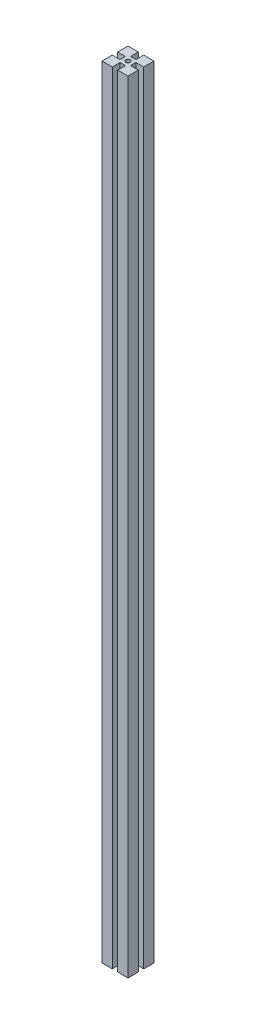
ISO-10303-21;
HEADER;
FILE_DESCRIPTION(('STEP AP214'),'2;1');
FILE_NAME('part.step','',(''),(''),'','','');
FILE_SCHEMA(('AUTOMOTIVE_DESIGN { 1 0 10303 214 1 1 1 1 }'));
ENDSEC;
DATA;
#1=APPLICATION_CONTEXT('core data for automotive mechanical design processes');
#2=APPLICATION_PROTOCOL_DEFINITION('international standard','automotive_design',2000,#1);
#3=PRODUCT_CONTEXT('',#1,'mechanical');
#4=PRODUCT('Part','Part','',(#3));
#5=PRODUCT_RELATED_PRODUCT_CATEGORY('part','',(#4));
#6=PRODUCT_DEFINITION_FORMATION('','',#4);
#7=PRODUCT_DEFINITION_CONTEXT('part definition',#1,'design');
#8=PRODUCT_DEFINITION('design','',#6,#7);
#9=PRODUCT_DEFINITION_SHAPE('','',#8);
#10=(LENGTH_UNIT() NAMED_UNIT(*) SI_UNIT(.MILLI.,.METRE.));
#11=(NAMED_UNIT(*) PLANE_ANGLE_UNIT() SI_UNIT($,.RADIAN.));
#12=(NAMED_UNIT(*) SI_UNIT($,.STERADIAN.) SOLID_ANGLE_UNIT());
#13=UNCERTAINTY_MEASURE_WITH_UNIT(LENGTH_MEASURE(1.E-05),#10,'distance_accuracy_value','');
#14=(GEOMETRIC_REPRESENTATION_CONTEXT(3) GLOBAL_UNCERTAINTY_ASSIGNED_CONTEXT((#13)) GLOBAL_UNIT_ASSIGNED_CONTEXT((#10,
#11,#12)) REPRESENTATION_CONTEXT('',''));
#15=CARTESIAN_POINT('',(0.,0.,0.));
#16=DIRECTION('',(0.,0.,1.));
#17=DIRECTION('',(1.,0.,0.));
#18=AXIS2_PLACEMENT_3D('',#15,#16,#17);
#19=CARTESIAN_POINT('',(20.,1200.,4.1));
#20=DIRECTION('',(-1.,0.,0.));
#21=DIRECTION('',(0.,0.,1.));
#22=AXIS2_PLACEMENT_3D('',#19,#20,#21);
#23=PLANE('',#22);
#24=DIRECTION('',(0.,0.,-1.));
#25=VECTOR('',#24,1.);
#26=CARTESIAN_POINT('',(20.,0.,4.1));
#27=LINE('',#26,#25);
#28=CARTESIAN_POINT('',(20.,0.,20.));
#29=VERTEX_POINT('',#28);
#30=CARTESIAN_POINT('',(20.,0.,4.1));
#31=VERTEX_POINT('',#30);
#32=EDGE_CURVE('E202',#29,#31,#27,.T.);
#33=ORIENTED_EDGE('',*,*,#32,.T.);
#34=DIRECTION('',(0.,-1.,0.));
#35=VECTOR('',#34,1.);
#36=CARTESIAN_POINT('',(20.,1200.,4.1));
#37=LINE('',#36,#35);
#38=CARTESIAN_POINT('',(20.,1200.,4.1));
#39=VERTEX_POINT('',#38);
#40=EDGE_CURVE('E11',#39,#31,#37,.T.);
#41=ORIENTED_EDGE('',*,*,#40,.F.);
#42=DIRECTION('',(0.,0.,-1.));
#43=VECTOR('',#42,1.);
#44=CARTESIAN_POINT('',(20.,1200.,4.1));
#45=LINE('',#44,#43);
#46=CARTESIAN_POINT('',(20.,1200.,20.));
#47=VERTEX_POINT('',#46);
#48=EDGE_CURVE('E241',#47,#39,#45,.T.);
#49=ORIENTED_EDGE('',*,*,#48,.F.);
#50=DIRECTION('',(0.,-1.,0.));
#51=VECTOR('',#50,1.);
#52=CARTESIAN_POINT('',(20.,1200.,20.));
#53=LINE('',#52,#51);
#54=EDGE_CURVE('E198',#47,#29,#53,.T.);
#55=ORIENTED_EDGE('',*,*,#54,.T.);
#56=EDGE_LOOP('',(#33,#41,#49,#55));
#57=FACE_BOUND('',#56,.T.);
#58=ADVANCED_FACE('F34',(#57),#23,.F.);
#59=CARTESIAN_POINT('',(8.,1200.,4.1));
#60=DIRECTION('',(0.,0.,1.));
#61=DIRECTION('',(1.,0.,0.));
#62=AXIS2_PLACEMENT_3D('',#59,#60,#61);
#63=PLANE('',#62);
#64=DIRECTION('',(-1.,0.,0.));
#65=VECTOR('',#64,1.);
#66=CARTESIAN_POINT('',(8.,0.,4.1));
#67=LINE('',#66,#65);
#68=CARTESIAN_POINT('',(8.,0.,4.1));
#69=VERTEX_POINT('',#68);
#70=EDGE_CURVE('E205',#31,#69,#67,.T.);
#71=ORIENTED_EDGE('',*,*,#70,.T.);
#72=DIRECTION('',(0.,-1.,0.));
#73=VECTOR('',#72,1.);
#74=CARTESIAN_POINT('',(8.,1200.,4.1));
#75=LINE('',#74,#73);
#76=CARTESIAN_POINT('',(8.,1200.,4.1));
#77=VERTEX_POINT('',#76);
#78=EDGE_CURVE('E42',#77,#69,#75,.T.);
#79=ORIENTED_EDGE('',*,*,#78,.F.);
#80=DIRECTION('',(-1.,0.,0.));
#81=VECTOR('',#80,1.);
#82=CARTESIAN_POINT('',(8.,1200.,4.1));
#83=LINE('',#82,#81);
#84=EDGE_CURVE('E129',#39,#77,#83,.T.);
#85=ORIENTED_EDGE('',*,*,#84,.F.);
#86=ORIENTED_EDGE('',*,*,#40,.T.);
#87=EDGE_LOOP('',(#71,#79,#85,#86));
#88=FACE_BOUND('',#87,.T.);
#89=ADVANCED_FACE('F360',(#88),#63,.F.);
#90=CARTESIAN_POINT('',(8.,1200.,-4.1));
#91=DIRECTION('',(-1.,0.,0.));
#92=DIRECTION('',(0.,0.,1.));
#93=AXIS2_PLACEMENT_3D('',#90,#91,#92);
#94=PLANE('',#93);
#95=DIRECTION('',(0.,0.,-1.));
#96=VECTOR('',#95,1.);
#97=CARTESIAN_POINT('',(8.,0.,-4.1));
#98=LINE('',#97,#96);
#99=CARTESIAN_POINT('',(8.,0.,-4.1));
#100=VERTEX_POINT('',#99);
#101=EDGE_CURVE('E208',#69,#100,#98,.T.);
#102=ORIENTED_EDGE('',*,*,#101,.T.);
#103=DIRECTION('',(0.,-1.,0.));
#104=VECTOR('',#103,1.);
#105=CARTESIAN_POINT('',(8.,1200.,-4.1));
#106=LINE('',#105,#104);
#107=CARTESIAN_POINT('',(8.,1200.,-4.1));
#108=VERTEX_POINT('',#107);
#109=EDGE_CURVE('E284',#108,#100,#106,.T.);
#110=ORIENTED_EDGE('',*,*,#109,.F.);
#111=DIRECTION('',(0.,0.,-1.));
#112=VECTOR('',#111,1.);
#113=CARTESIAN_POINT('',(8.,1200.,-4.1));
#114=LINE('',#113,#112);
#115=EDGE_CURVE('E292',#77,#108,#114,.T.);
#116=ORIENTED_EDGE('',*,*,#115,.F.);
#117=ORIENTED_EDGE('',*,*,#78,.T.);
#118=EDGE_LOOP('',(#102,#110,#116,#117));
#119=FACE_BOUND('',#118,.T.);
#120=ADVANCED_FACE('F290',(#119),#94,.F.);
#121=CARTESIAN_POINT('',(20.,1200.,-4.1));
#122=DIRECTION('',(0.,0.,-1.));
#123=DIRECTION('',(-1.,0.,0.));
#124=AXIS2_PLACEMENT_3D('',#121,#122,#123);
#125=PLANE('',#124);
#126=DIRECTION('',(1.,0.,0.));
#127=VECTOR('',#126,1.);
#128=CARTESIAN_POINT('',(20.,0.,-4.1));
#129=LINE('',#128,#127);
#130=CARTESIAN_POINT('',(20.,0.,-4.1));
#131=VERTEX_POINT('',#130);
#132=EDGE_CURVE('E210',#100,#131,#129,.T.);
#133=ORIENTED_EDGE('',*,*,#132,.T.);
#134=DIRECTION('',(0.,-1.,0.));
#135=VECTOR('',#134,1.);
#136=CARTESIAN_POINT('',(20.,1200.,-4.1));
#137=LINE('',#136,#135);
#138=CARTESIAN_POINT('',(20.,1200.,-4.1));
#139=VERTEX_POINT('',#138);
#140=EDGE_CURVE('E281',#139,#131,#137,.T.);
#141=ORIENTED_EDGE('',*,*,#140,.F.);
#142=DIRECTION('',(1.,0.,0.));
#143=VECTOR('',#142,1.);
#144=CARTESIAN_POINT('',(20.,1200.,-4.1));
#145=LINE('',#144,#143);
#146=EDGE_CURVE('E310',#108,#139,#145,.T.);
#147=ORIENTED_EDGE('',*,*,#146,.F.);
#148=ORIENTED_EDGE('',*,*,#109,.T.);
#149=EDGE_LOOP('',(#133,#141,#147,#148));
#150=FACE_BOUND('',#149,.T.);
#151=ADVANCED_FACE('F301',(#150),#125,.F.);
#152=CARTESIAN_POINT('',(20.,1200.,-20.));
#153=DIRECTION('',(-1.,0.,0.));
#154=DIRECTION('',(0.,0.,1.));
#155=AXIS2_PLACEMENT_3D('',#152,#153,#154);
#156=PLANE('',#155);
#157=DIRECTION('',(0.,0.,-1.));
#158=VECTOR('',#157,1.);
#159=CARTESIAN_POINT('',(20.,0.,-20.));
#160=LINE('',#159,#158);
#161=CARTESIAN_POINT('',(20.,0.,-20.));
#162=VERTEX_POINT('',#161);
#163=EDGE_CURVE('E212',#131,#162,#160,.T.);
#164=ORIENTED_EDGE('',*,*,#163,.T.);
#165=DIRECTION('',(0.,-1.,0.));
#166=VECTOR('',#165,1.);
#167=CARTESIAN_POINT('',(20.,1200.,-20.));
#168=LINE('',#167,#166);
#169=CARTESIAN_POINT('',(20.,1200.,-20.));
#170=VERTEX_POINT('',#169);
#171=EDGE_CURVE('E278',#170,#162,#168,.T.);
#172=ORIENTED_EDGE('',*,*,#171,.F.);
#173=DIRECTION('',(0.,0.,-1.));
#174=VECTOR('',#173,1.);
#175=CARTESIAN_POINT('',(20.,1200.,-20.));
#176=LINE('',#175,#174);
#177=EDGE_CURVE('E307',#139,#170,#176,.T.);
#178=ORIENTED_EDGE('',*,*,#177,.F.);
#179=ORIENTED_EDGE('',*,*,#140,.T.);
#180=EDGE_LOOP('',(#164,#172,#178,#179));
#181=FACE_BOUND('',#180,.T.);
#182=ADVANCED_FACE('F305',(#181),#156,.F.);
#183=CARTESIAN_POINT('',(4.10000000000001,1200.,-20.));
#184=DIRECTION('',(0.,0.,1.));
#185=DIRECTION('',(1.,0.,0.));
#186=AXIS2_PLACEMENT_3D('',#183,#184,#185);
#187=PLANE('',#186);
#188=DIRECTION('',(-1.,0.,0.));
#189=VECTOR('',#188,1.);
#190=CARTESIAN_POINT('',(4.10000000000001,0.,-20.));
#191=LINE('',#190,#189);
#192=CARTESIAN_POINT('',(4.10000000000001,0.,-20.));
#193=VERTEX_POINT('',#192);
#194=EDGE_CURVE('E214',#162,#193,#191,.T.);
#195=ORIENTED_EDGE('',*,*,#194,.T.);
#196=DIRECTION('',(0.,-1.,0.));
#197=VECTOR('',#196,1.);
#198=CARTESIAN_POINT('',(4.10000000000001,1200.,-20.));
#199=LINE('',#198,#197);
#200=CARTESIAN_POINT('',(4.10000000000001,1200.,-20.));
#201=VERTEX_POINT('',#200);
#202=EDGE_CURVE('E275',#201,#193,#199,.T.);
#203=ORIENTED_EDGE('',*,*,#202,.F.);
#204=DIRECTION('',(-1.,0.,0.));
#205=VECTOR('',#204,1.);
#206=CARTESIAN_POINT('',(4.10000000000001,1200.,-20.));
#207=LINE('',#206,#205);
#208=EDGE_CURVE('E309',#170,#201,#207,.T.);
#209=ORIENTED_EDGE('',*,*,#208,.F.);
#210=ORIENTED_EDGE('',*,*,#171,.T.);
#211=EDGE_LOOP('',(#195,#203,#209,#210));
#212=FACE_BOUND('',#211,.T.);
#213=ADVANCED_FACE('F373',(#212),#187,.F.);
#214=CARTESIAN_POINT('',(4.10000000000001,1200.,-7.99999999999999));
#215=DIRECTION('',(1.,0.,0.));
#216=DIRECTION('',(0.,0.,-1.));
#217=AXIS2_PLACEMENT_3D('',#214,#215,#216);
#218=PLANE('',#217);
#219=DIRECTION('',(0.,0.,1.));
#220=VECTOR('',#219,1.);
#221=CARTESIAN_POINT('',(4.10000000000001,0.,-7.99999999999999));
#222=LINE('',#221,#220);
#223=CARTESIAN_POINT('',(4.10000000000001,0.,-7.99999999999999));
#224=VERTEX_POINT('',#223);
#225=EDGE_CURVE('E216',#193,#224,#222,.T.);
#226=ORIENTED_EDGE('',*,*,#225,.T.);
#227=DIRECTION('',(0.,-1.,0.));
#228=VECTOR('',#227,1.);
#229=CARTESIAN_POINT('',(4.10000000000001,1200.,-7.99999999999999));
#230=LINE('',#229,#228);
#231=CARTESIAN_POINT('',(4.10000000000001,1200.,-7.99999999999999));
#232=VERTEX_POINT('',#231);
#233=EDGE_CURVE('E272',#232,#224,#230,.T.);
#234=ORIENTED_EDGE('',*,*,#233,.F.);
#235=DIRECTION('',(0.,0.,1.));
#236=VECTOR('',#235,1.);
#237=CARTESIAN_POINT('',(4.10000000000001,1200.,-7.99999999999999));
#238=LINE('',#237,#236);
#239=EDGE_CURVE('E312',#201,#232,#238,.T.);
#240=ORIENTED_EDGE('',*,*,#239,.F.);
#241=ORIENTED_EDGE('',*,*,#202,.T.);
#242=EDGE_LOOP('',(#226,#234,#240,#241));
#243=FACE_BOUND('',#242,.T.);
#244=ADVANCED_FACE('F376',(#243),#218,.F.);
#245=CARTESIAN_POINT('',(-4.09999999999999,1200.,-7.99999999999999));
#246=DIRECTION('',(0.,0.,1.));
#247=DIRECTION('',(1.,0.,0.));
#248=AXIS2_PLACEMENT_3D('',#245,#246,#247);
#249=PLANE('',#248);
#250=DIRECTION('',(-1.,0.,0.));
#251=VECTOR('',#250,1.);
#252=CARTESIAN_POINT('',(-4.09999999999999,0.,-7.99999999999999));
#253=LINE('',#252,#251);
#254=CARTESIAN_POINT('',(-4.09999999999999,0.,-7.99999999999999));
#255=VERTEX_POINT('',#254);
#256=EDGE_CURVE('E218',#224,#255,#253,.T.);
#257=ORIENTED_EDGE('',*,*,#256,.T.);
#258=DIRECTION('',(0.,-1.,0.));
#259=VECTOR('',#258,1.);
#260=CARTESIAN_POINT('',(-4.09999999999999,1200.,-7.99999999999999));
#261=LINE('',#260,#259);
#262=CARTESIAN_POINT('',(-4.09999999999999,1200.,-7.99999999999999));
#263=VERTEX_POINT('',#262);
#264=EDGE_CURVE('E269',#263,#255,#261,.T.);
#265=ORIENTED_EDGE('',*,*,#264,.F.);
#266=DIRECTION('',(-1.,0.,0.));
#267=VECTOR('',#266,1.);
#268=CARTESIAN_POINT('',(-4.09999999999999,1200.,-7.99999999999999));
#269=LINE('',#268,#267);
#270=EDGE_CURVE('E318',#232,#263,#269,.T.);
#271=ORIENTED_EDGE('',*,*,#270,.F.);
#272=ORIENTED_EDGE('',*,*,#233,.T.);
#273=EDGE_LOOP('',(#257,#265,#271,#272));
#274=FACE_BOUND('',#273,.T.);
#275=ADVANCED_FACE('F380',(#274),#249,.F.);
#276=CARTESIAN_POINT('',(-4.09999999999999,1200.,-20.));
#277=DIRECTION('',(-1.,0.,0.));
#278=DIRECTION('',(0.,0.,1.));
#279=AXIS2_PLACEMENT_3D('',#276,#277,#278);
#280=PLANE('',#279);
#281=DIRECTION('',(0.,0.,-1.));
#282=VECTOR('',#281,1.);
#283=CARTESIAN_POINT('',(-4.09999999999999,0.,-20.));
#284=LINE('',#283,#282);
#285=CARTESIAN_POINT('',(-4.09999999999999,0.,-20.));
#286=VERTEX_POINT('',#285);
#287=EDGE_CURVE('E220',#255,#286,#284,.T.);
#288=ORIENTED_EDGE('',*,*,#287,.T.);
#289=DIRECTION('',(0.,-1.,0.));
#290=VECTOR('',#289,1.);
#291=CARTESIAN_POINT('',(-4.09999999999999,1200.,-20.));
#292=LINE('',#291,#290);
#293=CARTESIAN_POINT('',(-4.09999999999999,1200.,-20.));
#294=VERTEX_POINT('',#293);
#295=EDGE_CURVE('E266',#294,#286,#292,.T.);
#296=ORIENTED_EDGE('',*,*,#295,.F.);
#297=DIRECTION('',(0.,0.,-1.));
#298=VECTOR('',#297,1.);
#299=CARTESIAN_POINT('',(-4.09999999999999,1200.,-20.));
#300=LINE('',#299,#298);
#301=EDGE_CURVE('E320',#263,#294,#300,.T.);
#302=ORIENTED_EDGE('',*,*,#301,.F.);
#303=ORIENTED_EDGE('',*,*,#264,.T.);
#304=EDGE_LOOP('',(#288,#296,#302,#303));
#305=FACE_BOUND('',#304,.T.);
#306=ADVANCED_FACE('F384',(#305),#280,.F.);
#307=CARTESIAN_POINT('',(-20.,1200.,-20.));
#308=DIRECTION('',(0.,0.,1.));
#309=DIRECTION('',(1.,0.,0.));
#310=AXIS2_PLACEMENT_3D('',#307,#308,#309);
#311=PLANE('',#310);
#312=DIRECTION('',(-1.,0.,0.));
#313=VECTOR('',#312,1.);
#314=CARTESIAN_POINT('',(-20.,0.,-20.));
#315=LINE('',#314,#313);
#316=CARTESIAN_POINT('',(-20.,0.,-20.));
#317=VERTEX_POINT('',#316);
#318=EDGE_CURVE('E222',#286,#317,#315,.T.);
#319=ORIENTED_EDGE('',*,*,#318,.T.);
#320=DIRECTION('',(0.,-1.,0.));
#321=VECTOR('',#320,1.);
#322=CARTESIAN_POINT('',(-20.,1200.,-20.));
#323=LINE('',#322,#321);
#324=CARTESIAN_POINT('',(-20.,1200.,-20.));
#325=VERTEX_POINT('',#324);
#326=EDGE_CURVE('E263',#325,#317,#323,.T.);
#327=ORIENTED_EDGE('',*,*,#326,.F.);
#328=DIRECTION('',(-1.,0.,0.));
#329=VECTOR('',#328,1.);
#330=CARTESIAN_POINT('',(-20.,1200.,-20.));
#331=LINE('',#330,#329);
#332=EDGE_CURVE('E322',#294,#325,#331,.T.);
#333=ORIENTED_EDGE('',*,*,#332,.F.);
#334=ORIENTED_EDGE('',*,*,#295,.T.);
#335=EDGE_LOOP('',(#319,#327,#333,#334));
#336=FACE_BOUND('',#335,.T.);
#337=ADVANCED_FACE('F388',(#336),#311,.F.);
#338=CARTESIAN_POINT('',(-20.,1200.,-20.));
#339=DIRECTION('',(1.,0.,0.));
#340=DIRECTION('',(0.,0.,-1.));
#341=AXIS2_PLACEMENT_3D('',#338,#339,#340);
#342=PLANE('',#341);
#343=DIRECTION('',(0.,0.,1.));
#344=VECTOR('',#343,1.);
#345=CARTESIAN_POINT('',(-20.,0.,-20.));
#346=LINE('',#345,#344);
#347=CARTESIAN_POINT('',(-20.,0.,-4.1));
#348=VERTEX_POINT('',#347);
#349=EDGE_CURVE('E224',#317,#348,#346,.T.);
#350=ORIENTED_EDGE('',*,*,#349,.T.);
#351=DIRECTION('',(0.,-1.,0.));
#352=VECTOR('',#351,1.);
#353=CARTESIAN_POINT('',(-20.,1200.,-4.1));
#354=LINE('',#353,#352);
#355=CARTESIAN_POINT('',(-20.,1200.,-4.1));
#356=VERTEX_POINT('',#355);
#357=EDGE_CURVE('E260',#356,#348,#354,.T.);
#358=ORIENTED_EDGE('',*,*,#357,.F.);
#359=DIRECTION('',(0.,0.,1.));
#360=VECTOR('',#359,1.);
#361=CARTESIAN_POINT('',(-20.,1200.,-20.));
#362=LINE('',#361,#360);
#363=EDGE_CURVE('E324',#325,#356,#362,.T.);
#364=ORIENTED_EDGE('',*,*,#363,.F.);
#365=ORIENTED_EDGE('',*,*,#326,.T.);
#366=EDGE_LOOP('',(#350,#358,#364,#365));
#367=FACE_BOUND('',#366,.T.);
#368=ADVANCED_FACE('F392',(#367),#342,.F.);
#369=CARTESIAN_POINT('',(-20.,1200.,-4.1));
#370=DIRECTION('',(0.,0.,-1.));
#371=DIRECTION('',(-1.,0.,0.));
#372=AXIS2_PLACEMENT_3D('',#369,#370,#371);
#373=PLANE('',#372);
#374=DIRECTION('',(1.,0.,0.));
#375=VECTOR('',#374,1.);
#376=CARTESIAN_POINT('',(-20.,0.,-4.1));
#377=LINE('',#376,#375);
#378=CARTESIAN_POINT('',(-8.,0.,-4.1));
#379=VERTEX_POINT('',#378);
#380=EDGE_CURVE('E226',#348,#379,#377,.T.);
#381=ORIENTED_EDGE('',*,*,#380,.T.);
#382=DIRECTION('',(0.,-1.,0.));
#383=VECTOR('',#382,1.);
#384=CARTESIAN_POINT('',(-8.,1200.,-4.1));
#385=LINE('',#384,#383);
#386=CARTESIAN_POINT('',(-8.,1200.,-4.1));
#387=VERTEX_POINT('',#386);
#388=EDGE_CURVE('E257',#387,#379,#385,.T.);
#389=ORIENTED_EDGE('',*,*,#388,.F.);
#390=DIRECTION('',(1.,0.,0.));
#391=VECTOR('',#390,1.);
#392=CARTESIAN_POINT('',(-20.,1200.,-4.1));
#393=LINE('',#392,#391);
#394=EDGE_CURVE('E326',#356,#387,#393,.T.);
#395=ORIENTED_EDGE('',*,*,#394,.F.);
#396=ORIENTED_EDGE('',*,*,#357,.T.);
#397=EDGE_LOOP('',(#381,#389,#395,#396));
#398=FACE_BOUND('',#397,.T.);
#399=ADVANCED_FACE('F396',(#398),#373,.F.);
#400=CARTESIAN_POINT('',(-8.,1200.,-4.1));
#401=DIRECTION('',(1.,0.,0.));
#402=DIRECTION('',(0.,0.,-1.));
#403=AXIS2_PLACEMENT_3D('',#400,#401,#402);
#404=PLANE('',#403);
#405=DIRECTION('',(0.,0.,1.));
#406=VECTOR('',#405,1.);
#407=CARTESIAN_POINT('',(-8.,0.,-4.1));
#408=LINE('',#407,#406);
#409=CARTESIAN_POINT('',(-8.,0.,4.1));
#410=VERTEX_POINT('',#409);
#411=EDGE_CURVE('E228',#379,#410,#408,.T.);
#412=ORIENTED_EDGE('',*,*,#411,.T.);
#413=DIRECTION('',(0.,-1.,0.));
#414=VECTOR('',#413,1.);
#415=CARTESIAN_POINT('',(-8.,1200.,4.1));
#416=LINE('',#415,#414);
#417=CARTESIAN_POINT('',(-8.,1200.,4.1));
#418=VERTEX_POINT('',#417);
#419=EDGE_CURVE('E254',#418,#410,#416,.T.);
#420=ORIENTED_EDGE('',*,*,#419,.F.);
#421=DIRECTION('',(0.,0.,1.));
#422=VECTOR('',#421,1.);
#423=CARTESIAN_POINT('',(-8.,1200.,-4.1));
#424=LINE('',#423,#422);
#425=EDGE_CURVE('E328',#387,#418,#424,.T.);
#426=ORIENTED_EDGE('',*,*,#425,.F.);
#427=ORIENTED_EDGE('',*,*,#388,.T.);
#428=EDGE_LOOP('',(#412,#420,#426,#427));
#429=FACE_BOUND('',#428,.T.);
#430=ADVANCED_FACE('F400',(#429),#404,.F.);
#431=CARTESIAN_POINT('',(-8.,1200.,4.1));
#432=DIRECTION('',(0.,0.,1.));
#433=DIRECTION('',(1.,0.,0.));
#434=AXIS2_PLACEMENT_3D('',#431,#432,#433);
#435=PLANE('',#434);
#436=DIRECTION('',(-1.,0.,0.));
#437=VECTOR('',#436,1.);
#438=CARTESIAN_POINT('',(-8.,0.,4.1));
#439=LINE('',#438,#437);
#440=CARTESIAN_POINT('',(-20.,0.,4.1));
#441=VERTEX_POINT('',#440);
#442=EDGE_CURVE('E230',#410,#441,#439,.T.);
#443=ORIENTED_EDGE('',*,*,#442,.T.);
#444=DIRECTION('',(0.,-1.,0.));
#445=VECTOR('',#444,1.);
#446=CARTESIAN_POINT('',(-20.,1200.,4.1));
#447=LINE('',#446,#445);
#448=CARTESIAN_POINT('',(-20.,1200.,4.1));
#449=VERTEX_POINT('',#448);
#450=EDGE_CURVE('E251',#449,#441,#447,.T.);
#451=ORIENTED_EDGE('',*,*,#450,.F.);
#452=DIRECTION('',(-1.,0.,0.));
#453=VECTOR('',#452,1.);
#454=CARTESIAN_POINT('',(-8.,1200.,4.1));
#455=LINE('',#454,#453);
#456=EDGE_CURVE('E330',#418,#449,#455,.T.);
#457=ORIENTED_EDGE('',*,*,#456,.F.);
#458=ORIENTED_EDGE('',*,*,#419,.T.);
#459=EDGE_LOOP('',(#443,#451,#457,#458));
#460=FACE_BOUND('',#459,.T.);
#461=ADVANCED_FACE('F404',(#460),#435,.F.);
#462=CARTESIAN_POINT('',(-20.,1200.,4.1));
#463=DIRECTION('',(1.,0.,0.));
#464=DIRECTION('',(0.,0.,-1.));
#465=AXIS2_PLACEMENT_3D('',#462,#463,#464);
#466=PLANE('',#465);
#467=DIRECTION('',(0.,0.,1.));
#468=VECTOR('',#467,1.);
#469=CARTESIAN_POINT('',(-20.,0.,4.1));
#470=LINE('',#469,#468);
#471=CARTESIAN_POINT('',(-20.,0.,20.));
#472=VERTEX_POINT('',#471);
#473=EDGE_CURVE('E232',#441,#472,#470,.T.);
#474=ORIENTED_EDGE('',*,*,#473,.T.);
#475=DIRECTION('',(0.,-1.,0.));
#476=VECTOR('',#475,1.);
#477=CARTESIAN_POINT('',(-20.,1200.,20.));
#478=LINE('',#477,#476);
#479=CARTESIAN_POINT('',(-20.,1200.,20.));
#480=VERTEX_POINT('',#479);
#481=EDGE_CURVE('E248',#480,#472,#478,.T.);
#482=ORIENTED_EDGE('',*,*,#481,.F.);
#483=DIRECTION('',(0.,0.,1.));
#484=VECTOR('',#483,1.);
#485=CARTESIAN_POINT('',(-20.,1200.,4.1));
#486=LINE('',#485,#484);
#487=EDGE_CURVE('E332',#449,#480,#486,.T.);
#488=ORIENTED_EDGE('',*,*,#487,.F.);
#489=ORIENTED_EDGE('',*,*,#450,.T.);
#490=EDGE_LOOP('',(#474,#482,#488,#489));
#491=FACE_BOUND('',#490,.T.);
#492=ADVANCED_FACE('F408',(#491),#466,.F.);
#493=CARTESIAN_POINT('',(-20.,1200.,20.));
#494=DIRECTION('',(0.,0.,-1.));
#495=DIRECTION('',(-1.,0.,0.));
#496=AXIS2_PLACEMENT_3D('',#493,#494,#495);
#497=PLANE('',#496);
#498=DIRECTION('',(1.,0.,0.));
#499=VECTOR('',#498,1.);
#500=CARTESIAN_POINT('',(-20.,0.,20.));
#501=LINE('',#500,#499);
#502=CARTESIAN_POINT('',(-4.09999999999999,0.,20.));
#503=VERTEX_POINT('',#502);
#504=EDGE_CURVE('E234',#472,#503,#501,.T.);
#505=ORIENTED_EDGE('',*,*,#504,.T.);
#506=DIRECTION('',(0.,-1.,0.));
#507=VECTOR('',#506,1.);
#508=CARTESIAN_POINT('',(-4.09999999999999,1200.,20.));
#509=LINE('',#508,#507);
#510=CARTESIAN_POINT('',(-4.09999999999999,1200.,20.));
#511=VERTEX_POINT('',#510);
#512=EDGE_CURVE('E245',#511,#503,#509,.T.);
#513=ORIENTED_EDGE('',*,*,#512,.F.);
#514=DIRECTION('',(1.,0.,0.));
#515=VECTOR('',#514,1.);
#516=CARTESIAN_POINT('',(-20.,1200.,20.));
#517=LINE('',#516,#515);
#518=EDGE_CURVE('E334',#480,#511,#517,.T.);
#519=ORIENTED_EDGE('',*,*,#518,.F.);
#520=ORIENTED_EDGE('',*,*,#481,.T.);
#521=EDGE_LOOP('',(#505,#513,#519,#520));
#522=FACE_BOUND('',#521,.T.);
#523=ADVANCED_FACE('F340',(#522),#497,.F.);
#524=CARTESIAN_POINT('',(-4.09999999999999,1200.,20.));
#525=DIRECTION('',(-1.,0.,0.));
#526=DIRECTION('',(0.,0.,1.));
#527=AXIS2_PLACEMENT_3D('',#524,#525,#526);
#528=PLANE('',#527);
#529=DIRECTION('',(0.,0.,-1.));
#530=VECTOR('',#529,1.);
#531=CARTESIAN_POINT('',(-4.09999999999999,0.,20.));
#532=LINE('',#531,#530);
#533=CARTESIAN_POINT('',(-4.09999999999999,0.,7.99999999999999));
#534=VERTEX_POINT('',#533);
#535=EDGE_CURVE('E236',#503,#534,#532,.T.);
#536=ORIENTED_EDGE('',*,*,#535,.T.);
#537=DIRECTION('',(0.,-1.,0.));
#538=VECTOR('',#537,1.);
#539=CARTESIAN_POINT('',(-4.09999999999999,1200.,7.99999999999999));
#540=LINE('',#539,#538);
#541=CARTESIAN_POINT('',(-4.09999999999999,1200.,7.99999999999999));
#542=VERTEX_POINT('',#541);
#543=EDGE_CURVE('E193',#542,#534,#540,.T.);
#544=ORIENTED_EDGE('',*,*,#543,.F.);
#545=DIRECTION('',(0.,0.,-1.));
#546=VECTOR('',#545,1.);
#547=CARTESIAN_POINT('',(-4.09999999999999,1200.,20.));
#548=LINE('',#547,#546);
#549=EDGE_CURVE('E184',#511,#542,#548,.T.);
#550=ORIENTED_EDGE('',*,*,#549,.F.);
#551=ORIENTED_EDGE('',*,*,#512,.T.);
#552=EDGE_LOOP('',(#536,#544,#550,#551));
#553=FACE_BOUND('',#552,.T.);
#554=ADVANCED_FACE('F344',(#553),#528,.F.);
#555=CARTESIAN_POINT('',(-4.09999999999999,1200.,7.99999999999999));
#556=DIRECTION('',(0.,0.,-1.));
#557=DIRECTION('',(-1.,0.,0.));
#558=AXIS2_PLACEMENT_3D('',#555,#556,#557);
#559=PLANE('',#558);
#560=DIRECTION('',(1.,0.,0.));
#561=VECTOR('',#560,1.);
#562=CARTESIAN_POINT('',(-4.09999999999999,0.,7.99999999999999));
#563=LINE('',#562,#561);
#564=CARTESIAN_POINT('',(4.10000000000001,0.,7.99999999999999));
#565=VERTEX_POINT('',#564);
#566=EDGE_CURVE('E192',#534,#565,#563,.T.);
#567=ORIENTED_EDGE('',*,*,#566,.T.);
#568=DIRECTION('',(0.,-1.,0.));
#569=VECTOR('',#568,1.);
#570=CARTESIAN_POINT('',(4.10000000000001,1200.,7.99999999999999));
#571=LINE('',#570,#569);
#572=CARTESIAN_POINT('',(4.10000000000001,1200.,7.99999999999999));
#573=VERTEX_POINT('',#572);
#574=EDGE_CURVE('E189',#573,#565,#571,.T.);
#575=ORIENTED_EDGE('',*,*,#574,.F.);
#576=DIRECTION('',(1.,0.,0.));
#577=VECTOR('',#576,1.);
#578=CARTESIAN_POINT('',(-4.09999999999999,1200.,7.99999999999999));
#579=LINE('',#578,#577);
#580=EDGE_CURVE('E178',#542,#573,#579,.T.);
#581=ORIENTED_EDGE('',*,*,#580,.F.);
#582=ORIENTED_EDGE('',*,*,#543,.T.);
#583=EDGE_LOOP('',(#567,#575,#581,#582));
#584=FACE_BOUND('',#583,.T.);
#585=ADVANCED_FACE('F190',(#584),#559,.F.);
#586=CARTESIAN_POINT('',(4.10000000000001,1200.,7.99999999999999));
#587=DIRECTION('',(1.,0.,0.));
#588=DIRECTION('',(0.,0.,-1.));
#589=AXIS2_PLACEMENT_3D('',#586,#587,#588);
#590=PLANE('',#589);
#591=DIRECTION('',(0.,0.,1.));
#592=VECTOR('',#591,1.);
#593=CARTESIAN_POINT('',(4.10000000000001,0.,7.99999999999999));
#594=LINE('',#593,#592);
#595=CARTESIAN_POINT('',(4.10000000000001,0.,20.));
#596=VERTEX_POINT('',#595);
#597=EDGE_CURVE('E115',#565,#596,#594,.T.);
#598=ORIENTED_EDGE('',*,*,#597,.T.);
#599=DIRECTION('',(0.,-1.,0.));
#600=VECTOR('',#599,1.);
#601=CARTESIAN_POINT('',(4.10000000000001,1200.,20.));
#602=LINE('',#601,#600);
#603=CARTESIAN_POINT('',(4.10000000000001,1200.,20.));
#604=VERTEX_POINT('',#603);
#605=EDGE_CURVE('E194',#604,#596,#602,.T.);
#606=ORIENTED_EDGE('',*,*,#605,.F.);
#607=DIRECTION('',(0.,0.,1.));
#608=VECTOR('',#607,1.);
#609=CARTESIAN_POINT('',(4.10000000000001,1200.,7.99999999999999));
#610=LINE('',#609,#608);
#611=EDGE_CURVE('E182',#573,#604,#610,.T.);
#612=ORIENTED_EDGE('',*,*,#611,.F.);
#613=ORIENTED_EDGE('',*,*,#574,.T.);
#614=EDGE_LOOP('',(#598,#606,#612,#613));
#615=FACE_BOUND('',#614,.T.);
#616=ADVANCED_FACE('F196',(#615),#590,.F.);
#617=CARTESIAN_POINT('',(4.10000000000001,1200.,20.));
#618=DIRECTION('',(0.,0.,-1.));
#619=DIRECTION('',(-1.,0.,0.));
#620=AXIS2_PLACEMENT_3D('',#617,#618,#619);
#621=PLANE('',#620);
#622=DIRECTION('',(1.,0.,0.));
#623=VECTOR('',#622,1.);
#624=CARTESIAN_POINT('',(4.10000000000001,0.,20.));
#625=LINE('',#624,#623);
#626=EDGE_CURVE('E121',#596,#29,#625,.T.);
#627=ORIENTED_EDGE('',*,*,#626,.T.);
#628=ORIENTED_EDGE('',*,*,#54,.F.);
#629=DIRECTION('',(1.,0.,0.));
#630=VECTOR('',#629,1.);
#631=CARTESIAN_POINT('',(4.10000000000001,1200.,20.));
#632=LINE('',#631,#630);
#633=EDGE_CURVE('E50',#604,#47,#632,.T.);
#634=ORIENTED_EDGE('',*,*,#633,.F.);
#635=ORIENTED_EDGE('',*,*,#605,.T.);
#636=EDGE_LOOP('',(#627,#628,#634,#635));
#637=FACE_BOUND('',#636,.T.);
#638=ADVANCED_FACE('F348',(#637),#621,.F.);
#639=CARTESIAN_POINT('',(0.,1200.,0.));
#640=DIRECTION('',(0.,1.,0.));
#641=DIRECTION('',(0.,0.,1.));
#642=AXIS2_PLACEMENT_3D('',#639,#640,#641);
#643=PLANE('',#642);
#644=CARTESIAN_POINT('',(0.,1200.,0.));
#645=DIRECTION('',(0.,1.,0.));
#646=DIRECTION('',(0.,0.,1.));
#647=AXIS2_PLACEMENT_3D('',#644,#645,#646);
#648=CIRCLE('',#647,3.45);
#649=CARTESIAN_POINT('',(0.,1200.,3.45));
#650=VERTEX_POINT('',#649);
#651=EDGE_CURVE('E469',#650,#650,#648,.T.);
#652=ORIENTED_EDGE('',*,*,#651,.F.);
#653=EDGE_LOOP('',(#652));
#654=FACE_BOUND('',#653,.T.);
#655=ORIENTED_EDGE('',*,*,#48,.T.);
#656=ORIENTED_EDGE('',*,*,#84,.T.);
#657=ORIENTED_EDGE('',*,*,#115,.T.);
#658=ORIENTED_EDGE('',*,*,#146,.T.);
#659=ORIENTED_EDGE('',*,*,#177,.T.);
#660=ORIENTED_EDGE('',*,*,#208,.T.);
#661=ORIENTED_EDGE('',*,*,#239,.T.);
#662=ORIENTED_EDGE('',*,*,#270,.T.);
#663=ORIENTED_EDGE('',*,*,#301,.T.);
#664=ORIENTED_EDGE('',*,*,#332,.T.);
#665=ORIENTED_EDGE('',*,*,#363,.T.);
#666=ORIENTED_EDGE('',*,*,#394,.T.);
#667=ORIENTED_EDGE('',*,*,#425,.T.);
#668=ORIENTED_EDGE('',*,*,#456,.T.);
#669=ORIENTED_EDGE('',*,*,#487,.T.);
#670=ORIENTED_EDGE('',*,*,#518,.T.);
#671=ORIENTED_EDGE('',*,*,#549,.T.);
#672=ORIENTED_EDGE('',*,*,#580,.T.);
#673=ORIENTED_EDGE('',*,*,#611,.T.);
#674=ORIENTED_EDGE('',*,*,#633,.T.);
#675=EDGE_LOOP('',(#655,#656,#657,#658,#659,#660,#661,#662,#663,#664,#665,#666,#667,#668,#669,
#670,#671,#672,#673,#674));
#676=FACE_BOUND('',#675,.T.);
#677=ADVANCED_FACE('F180',(#654,#676),#643,.T.);
#678=CARTESIAN_POINT('',(0.,0.,0.));
#679=DIRECTION('',(0.,1.,0.));
#680=DIRECTION('',(0.,0.,1.));
#681=AXIS2_PLACEMENT_3D('',#678,#679,#680);
#682=PLANE('',#681);
#683=ORIENTED_EDGE('',*,*,#32,.F.);
#684=ORIENTED_EDGE('',*,*,#626,.F.);
#685=ORIENTED_EDGE('',*,*,#597,.F.);
#686=ORIENTED_EDGE('',*,*,#566,.F.);
#687=ORIENTED_EDGE('',*,*,#535,.F.);
#688=ORIENTED_EDGE('',*,*,#504,.F.);
#689=ORIENTED_EDGE('',*,*,#473,.F.);
#690=ORIENTED_EDGE('',*,*,#442,.F.);
#691=ORIENTED_EDGE('',*,*,#411,.F.);
#692=ORIENTED_EDGE('',*,*,#380,.F.);
#693=ORIENTED_EDGE('',*,*,#349,.F.);
#694=ORIENTED_EDGE('',*,*,#318,.F.);
#695=ORIENTED_EDGE('',*,*,#287,.F.);
#696=ORIENTED_EDGE('',*,*,#256,.F.);
#697=ORIENTED_EDGE('',*,*,#225,.F.);
#698=ORIENTED_EDGE('',*,*,#194,.F.);
#699=ORIENTED_EDGE('',*,*,#163,.F.);
#700=ORIENTED_EDGE('',*,*,#132,.F.);
#701=ORIENTED_EDGE('',*,*,#101,.F.);
#702=ORIENTED_EDGE('',*,*,#70,.F.);
#703=EDGE_LOOP('',(#683,#684,#685,#686,#687,#688,#689,#690,#691,#692,#693,#694,#695,#696,#697,
#698,#699,#700,#701,#702));
#704=FACE_BOUND('',#703,.T.);
#705=ADVANCED_FACE('F296',(#704),#682,.F.);
#706=CARTESIAN_POINT('',(0.,1170.,0.));
#707=DIRECTION('',(0.,1.,0.));
#708=DIRECTION('',(0.,0.,1.));
#709=AXIS2_PLACEMENT_3D('',#706,#707,#708);
#710=CYLINDRICAL_SURFACE('',#709,3.45);
#711=CARTESIAN_POINT('',(0.,1170.,0.));
#712=DIRECTION('',(0.,1.,0.));
#713=DIRECTION('',(0.,0.,1.));
#714=AXIS2_PLACEMENT_3D('',#711,#712,#713);
#715=CIRCLE('',#714,3.45);
#716=CARTESIAN_POINT('',(0.,1170.,3.45));
#717=VERTEX_POINT('',#716);
#718=EDGE_CURVE('E206',#717,#717,#715,.T.);
#719=ORIENTED_EDGE('',*,*,#718,.F.);
#720=EDGE_LOOP('',(#719));
#721=FACE_BOUND('',#720,.T.);
#722=ORIENTED_EDGE('',*,*,#651,.T.);
#723=EDGE_LOOP('',(#722));
#724=FACE_BOUND('',#723,.T.);
#725=ADVANCED_FACE('F440',(#721,#724),#710,.F.);
#726=CARTESIAN_POINT('',(0.,1170.,0.));
#727=DIRECTION('',(0.,1.,0.));
#728=DIRECTION('',(0.,0.,1.));
#729=AXIS2_PLACEMENT_3D('',#726,#727,#728);
#730=PLANE('',#729);
#731=ORIENTED_EDGE('',*,*,#718,.T.);
#732=EDGE_LOOP('',(#731));
#733=FACE_BOUND('',#732,.T.);
#734=ADVANCED_FACE('F453',(#733),#730,.T.);
#735=CLOSED_SHELL('',(#58,#89,#120,#151,#182,#213,#244,#275,#306,#337,#368,#399,#430,#461,#492,
#523,#554,#585,#616,#638,#677,#705,#725,#734));
#736=MANIFOLD_SOLID_BREP('B2',#735);
#737=ADVANCED_BREP_SHAPE_REPRESENTATION('',(#18,#736),#14);
#738=SHAPE_DEFINITION_REPRESENTATION(#9,#737);
ENDSEC;
END-ISO-10303-21;
